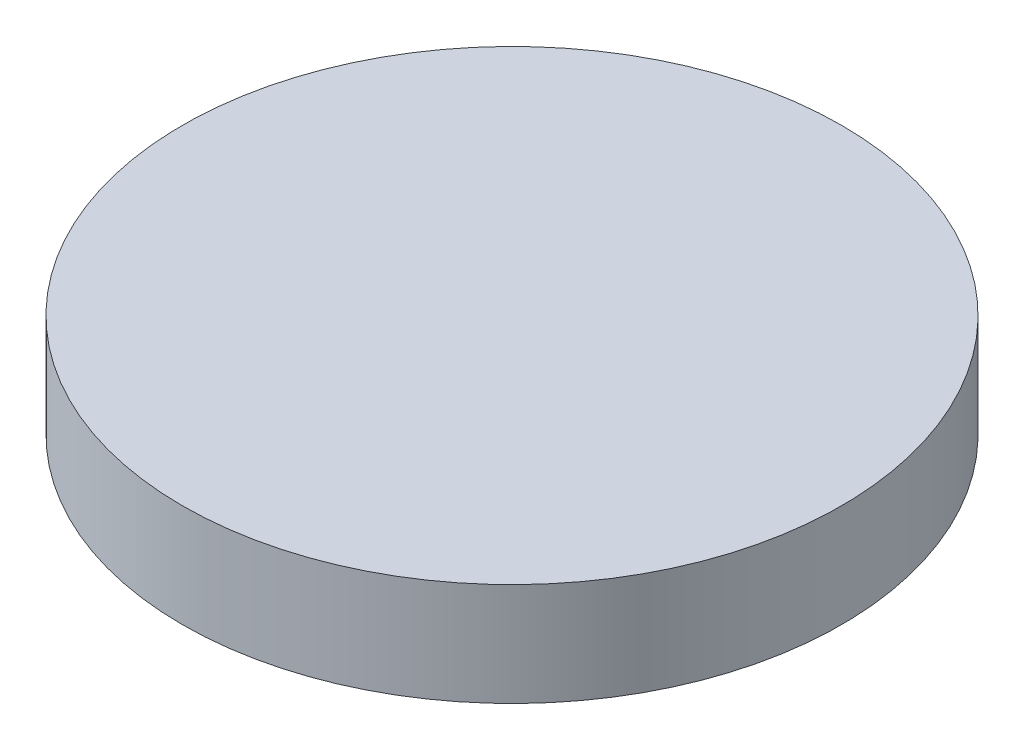
ISO-10303-21;
HEADER;
FILE_DESCRIPTION(('STEP AP214'),'2;1');
FILE_NAME('part.step','',(''),(''),'','','');
FILE_SCHEMA(('AUTOMOTIVE_DESIGN { 1 0 10303 214 1 1 1 1 }'));
ENDSEC;
DATA;
#1=APPLICATION_CONTEXT('core data for automotive mechanical design processes');
#2=APPLICATION_PROTOCOL_DEFINITION('international standard','automotive_design',2000,#1);
#3=PRODUCT_CONTEXT('',#1,'mechanical');
#4=PRODUCT('Part','Part','',(#3));
#5=PRODUCT_RELATED_PRODUCT_CATEGORY('part','',(#4));
#6=PRODUCT_DEFINITION_FORMATION('','',#4);
#7=PRODUCT_DEFINITION_CONTEXT('part definition',#1,'design');
#8=PRODUCT_DEFINITION('design','',#6,#7);
#9=PRODUCT_DEFINITION_SHAPE('','',#8);
#10=(LENGTH_UNIT() NAMED_UNIT(*) SI_UNIT(.MILLI.,.METRE.));
#11=(NAMED_UNIT(*) PLANE_ANGLE_UNIT() SI_UNIT($,.RADIAN.));
#12=(NAMED_UNIT(*) SI_UNIT($,.STERADIAN.) SOLID_ANGLE_UNIT());
#13=UNCERTAINTY_MEASURE_WITH_UNIT(LENGTH_MEASURE(1.E-05),#10,'distance_accuracy_value','');
#14=(GEOMETRIC_REPRESENTATION_CONTEXT(3) GLOBAL_UNCERTAINTY_ASSIGNED_CONTEXT((#13)) GLOBAL_UNIT_ASSIGNED_CONTEXT((#10,
#11,#12)) REPRESENTATION_CONTEXT('',''));
#15=CARTESIAN_POINT('',(0.,0.,0.));
#16=DIRECTION('',(0.,0.,1.));
#17=DIRECTION('',(1.,0.,0.));
#18=AXIS2_PLACEMENT_3D('',#15,#16,#17);
#19=CARTESIAN_POINT('',(0.,3.175,0.));
#20=DIRECTION('',(0.,-1.,0.));
#21=DIRECTION('',(0.,0.,-1.));
#22=AXIS2_PLACEMENT_3D('',#19,#20,#21);
#23=CYLINDRICAL_SURFACE('',#22,10.16);
#24=CARTESIAN_POINT('',(0.,3.175,0.));
#25=DIRECTION('',(0.,1.,0.));
#26=DIRECTION('',(0.,0.,1.));
#27=AXIS2_PLACEMENT_3D('',#24,#25,#26);
#28=CIRCLE('',#27,10.16);
#29=CARTESIAN_POINT('',(0.,3.175,10.16));
#30=VERTEX_POINT('',#29);
#31=EDGE_CURVE('E10',#30,#30,#28,.T.);
#32=ORIENTED_EDGE('',*,*,#31,.F.);
#33=EDGE_LOOP('',(#32));
#34=FACE_BOUND('',#33,.T.);
#35=CARTESIAN_POINT('',(0.,0.,0.));
#36=DIRECTION('',(0.,1.,0.));
#37=DIRECTION('',(0.,0.,1.));
#38=AXIS2_PLACEMENT_3D('',#35,#36,#37);
#39=CIRCLE('',#38,10.16);
#40=CARTESIAN_POINT('',(0.,0.,10.16));
#41=VERTEX_POINT('',#40);
#42=EDGE_CURVE('E40',#41,#41,#39,.T.);
#43=ORIENTED_EDGE('',*,*,#42,.T.);
#44=EDGE_LOOP('',(#43));
#45=FACE_BOUND('',#44,.T.);
#46=ADVANCED_FACE('F37',(#34,#45),#23,.T.);
#47=CARTESIAN_POINT('',(0.,3.175,0.));
#48=DIRECTION('',(0.,1.,0.));
#49=DIRECTION('',(0.,0.,1.));
#50=AXIS2_PLACEMENT_3D('',#47,#48,#49);
#51=PLANE('',#50);
#52=ORIENTED_EDGE('',*,*,#31,.T.);
#53=EDGE_LOOP('',(#52));
#54=FACE_BOUND('',#53,.T.);
#55=ADVANCED_FACE('F93',(#54),#51,.T.);
#56=CARTESIAN_POINT('',(0.,0.,0.));
#57=DIRECTION('',(0.,1.,0.));
#58=DIRECTION('',(0.,0.,1.));
#59=AXIS2_PLACEMENT_3D('',#56,#57,#58);
#60=PLANE('',#59);
#61=CARTESIAN_POINT('',(0.,0.,-4.953));
#62=DIRECTION('',(0.,-1.,0.));
#63=DIRECTION('',(0.,0.,-1.));
#64=AXIS2_PLACEMENT_3D('',#61,#62,#63);
#65=CIRCLE('',#64,4.550000044);
#66=CARTESIAN_POINT('',(0.,0.,-9.503000044));
#67=VERTEX_POINT('',#66);
#68=EDGE_CURVE('E62',#67,#67,#65,.T.);
#69=ORIENTED_EDGE('',*,*,#68,.F.);
#70=EDGE_LOOP('',(#69));
#71=FACE_BOUND('',#70,.T.);
#72=CARTESIAN_POINT('',(0.,0.,4.953));
#73=DIRECTION('',(0.,-1.,0.));
#74=DIRECTION('',(0.,0.,-1.));
#75=AXIS2_PLACEMENT_3D('',#72,#73,#74);
#76=CIRCLE('',#75,4.550000044);
#77=CARTESIAN_POINT('',(0.,0.,0.402999955999999));
#78=VERTEX_POINT('',#77);
#79=EDGE_CURVE('E53',#78,#78,#76,.T.);
#80=ORIENTED_EDGE('',*,*,#79,.F.);
#81=EDGE_LOOP('',(#80));
#82=FACE_BOUND('',#81,.T.);
#83=ORIENTED_EDGE('',*,*,#42,.F.);
#84=EDGE_LOOP('',(#83));
#85=FACE_BOUND('',#84,.T.);
#86=ADVANCED_FACE('F89',(#71,#82,#85),#60,.F.);
#87=CARTESIAN_POINT('',(0.,1.524,4.953));
#88=DIRECTION('',(0.,-1.,0.));
#89=DIRECTION('',(0.,0.,-1.));
#90=AXIS2_PLACEMENT_3D('',#87,#88,#89);
#91=CYLINDRICAL_SURFACE('',#90,4.550000044);
#92=CARTESIAN_POINT('',(0.,1.524,4.953));
#93=DIRECTION('',(0.,-1.,0.));
#94=DIRECTION('',(0.,0.,-1.));
#95=AXIS2_PLACEMENT_3D('',#92,#93,#94);
#96=CIRCLE('',#95,4.550000044);
#97=CARTESIAN_POINT('',(0.,1.524,0.402999955999999));
#98=VERTEX_POINT('',#97);
#99=EDGE_CURVE('E57',#98,#98,#96,.T.);
#100=CARTESIAN_POINT('',(0.,1.524,0.402999955999999));
#101=CARTESIAN_POINT('',(0.,1.508125,0.402999955999999));
#102=CARTESIAN_POINT('',(0.,1.49225,0.402999955999999));
#103=CARTESIAN_POINT('',(0.,1.4605,0.402999955999999));
#104=CARTESIAN_POINT('',(0.,1.444625,0.402999955999999));
#105=CARTESIAN_POINT('',(0.,1.412875,0.402999955999999));
#106=CARTESIAN_POINT('',(0.,1.397,0.402999955999999));
#107=CARTESIAN_POINT('',(0.,1.36525,0.402999955999999));
#108=CARTESIAN_POINT('',(0.,1.349375,0.402999955999999));
#109=CARTESIAN_POINT('',(0.,1.317625,0.402999955999999));
#110=CARTESIAN_POINT('',(0.,1.30175,0.402999955999999));
#111=CARTESIAN_POINT('',(0.,1.27,0.402999955999999));
#112=CARTESIAN_POINT('',(0.,1.254125,0.402999955999999));
#113=CARTESIAN_POINT('',(0.,1.222375,0.402999955999999));
#114=CARTESIAN_POINT('',(0.,1.2065,0.402999955999999));
#115=CARTESIAN_POINT('',(0.,1.17475,0.402999955999999));
#116=CARTESIAN_POINT('',(0.,1.158875,0.402999955999999));
#117=CARTESIAN_POINT('',(0.,1.127125,0.402999955999999));
#118=CARTESIAN_POINT('',(0.,1.11125,0.402999955999999));
#119=CARTESIAN_POINT('',(0.,1.0795,0.402999955999999));
#120=CARTESIAN_POINT('',(0.,1.063625,0.402999955999999));
#121=CARTESIAN_POINT('',(0.,1.031875,0.402999955999999));
#122=CARTESIAN_POINT('',(0.,1.016,0.402999955999999));
#123=CARTESIAN_POINT('',(0.,0.98425,0.402999955999999));
#124=CARTESIAN_POINT('',(0.,0.968375,0.402999955999999));
#125=CARTESIAN_POINT('',(0.,0.936625,0.402999955999999));
#126=CARTESIAN_POINT('',(0.,0.92075,0.402999955999999));
#127=CARTESIAN_POINT('',(0.,0.889,0.402999955999999));
#128=CARTESIAN_POINT('',(0.,0.873125,0.402999955999999));
#129=CARTESIAN_POINT('',(0.,0.841375,0.402999955999999));
#130=CARTESIAN_POINT('',(0.,0.8255,0.402999955999999));
#131=CARTESIAN_POINT('',(0.,0.79375,0.402999955999999));
#132=CARTESIAN_POINT('',(0.,0.777875,0.402999955999999));
#133=CARTESIAN_POINT('',(0.,0.746125,0.402999955999999));
#134=CARTESIAN_POINT('',(0.,0.73025,0.402999955999999));
#135=CARTESIAN_POINT('',(0.,0.6985,0.402999955999999));
#136=CARTESIAN_POINT('',(0.,0.682625,0.402999955999999));
#137=CARTESIAN_POINT('',(0.,0.650875,0.402999955999999));
#138=CARTESIAN_POINT('',(0.,0.635,0.402999955999999));
#139=CARTESIAN_POINT('',(0.,0.60325,0.402999955999999));
#140=CARTESIAN_POINT('',(0.,0.587375,0.402999955999999));
#141=CARTESIAN_POINT('',(0.,0.555625,0.402999955999999));
#142=CARTESIAN_POINT('',(0.,0.53975,0.402999955999999));
#143=CARTESIAN_POINT('',(0.,0.508,0.402999955999999));
#144=CARTESIAN_POINT('',(0.,0.492125,0.402999955999999));
#145=CARTESIAN_POINT('',(0.,0.460375,0.402999955999999));
#146=CARTESIAN_POINT('',(0.,0.4445,0.402999955999999));
#147=CARTESIAN_POINT('',(0.,0.41275,0.402999955999999));
#148=CARTESIAN_POINT('',(0.,0.396875,0.402999955999999));
#149=CARTESIAN_POINT('',(0.,0.365125,0.402999955999999));
#150=CARTESIAN_POINT('',(0.,0.34925,0.402999955999999));
#151=CARTESIAN_POINT('',(0.,0.3175,0.402999955999999));
#152=CARTESIAN_POINT('',(0.,0.301625,0.402999955999999));
#153=CARTESIAN_POINT('',(0.,0.269875,0.402999955999999));
#154=CARTESIAN_POINT('',(0.,0.254,0.402999955999999));
#155=CARTESIAN_POINT('',(0.,0.22225,0.402999955999999));
#156=CARTESIAN_POINT('',(0.,0.206375,0.402999955999999));
#157=CARTESIAN_POINT('',(0.,0.174625,0.402999955999999));
#158=CARTESIAN_POINT('',(0.,0.15875,0.402999955999999));
#159=CARTESIAN_POINT('',(0.,0.127,0.402999955999999));
#160=CARTESIAN_POINT('',(0.,0.111125,0.402999955999999));
#161=CARTESIAN_POINT('',(0.,0.079375,0.402999955999999));
#162=CARTESIAN_POINT('',(0.,0.0635,0.402999955999999));
#163=CARTESIAN_POINT('',(0.,0.0317499999999999,0.402999955999999));
#164=CARTESIAN_POINT('',(0.,0.015875,0.402999955999999));
#165=CARTESIAN_POINT('',(0.,0.,0.402999955999999));
#166=B_SPLINE_CURVE_WITH_KNOTS('',3,(#100,#101,#102,#103,#104,#105,#106,#107,#108,#109,#110,
#111,#112,#113,#114,#115,#116,#117,#118,#119,#120,#121,#122,#123,#124,#125,#126,#127,#128,#129,
#130,#131,#132,#133,#134,#135,#136,#137,#138,#139,#140,#141,#142,#143,#144,#145,#146,#147,#148,
#149,#150,#151,#152,#153,#154,#155,#156,#157,#158,#159,#160,#161,#162,#163,#164,#165),
.UNSPECIFIED.,.F.,.F.,(4,2,2,2,2,2,2,2,2,2,2,2,2,2,2,2,2,2,2,2,2,2,2,2,2,2,2,2,2,2,2,2,4),(0.,
0.0476250000000001,0.0952500000000001,0.142875,0.1905,0.238125,0.28575,0.333375,0.381,0.428625,
0.47625,0.523875,0.5715,0.619125,0.66675,0.714375,0.762,0.809625,0.85725,0.904875,0.9525,
1.000125,1.04775,1.095375,1.143,1.190625,1.23825,1.285875,1.3335,1.381125,1.42875,1.476375,
1.524),.UNSPECIFIED.);
#167=EDGE_CURVE('BSEAM92',#98,#78,#166,.T.);
#168=ORIENTED_EDGE('',*,*,#99,.F.);
#169=ORIENTED_EDGE('',*,*,#79,.T.);
#170=ORIENTED_EDGE('',*,*,#167,.T.);
#171=ORIENTED_EDGE('',*,*,#167,.F.);
#172=EDGE_LOOP('',(#168,#170,#169,#171));
#173=FACE_BOUND('',#172,.T.);
#174=ADVANCED_FACE('F92',(#173),#91,.F.);
#175=CARTESIAN_POINT('',(0.,1.524,4.953));
#176=DIRECTION('',(0.,-1.,0.));
#177=DIRECTION('',(0.,0.,-1.));
#178=AXIS2_PLACEMENT_3D('',#175,#176,#177);
#179=PLANE('',#178);
#180=CARTESIAN_POINT('',(0.,1.524,4.953));
#181=DIRECTION('',(0.,-1.,0.));
#182=DIRECTION('',(0.,0.,-1.));
#183=AXIS2_PLACEMENT_3D('',#180,#181,#182);
#184=CIRCLE('',#183,3.550000044);
#185=CARTESIAN_POINT('',(0.,1.524,1.402999956));
#186=VERTEX_POINT('',#185);
#187=EDGE_CURVE('E49',#186,#186,#184,.T.);
#188=ORIENTED_EDGE('',*,*,#187,.F.);
#189=EDGE_LOOP('',(#188));
#190=FACE_BOUND('',#189,.T.);
#191=ORIENTED_EDGE('',*,*,#99,.T.);
#192=EDGE_LOOP('',(#191));
#193=FACE_BOUND('',#192,.T.);
#194=ADVANCED_FACE('F111',(#190,#193),#179,.T.);
#195=CARTESIAN_POINT('',(0.,1.524,4.953));
#196=DIRECTION('',(0.,-1.,0.));
#197=DIRECTION('',(0.,0.,-1.));
#198=AXIS2_PLACEMENT_3D('',#195,#196,#197);
#199=CYLINDRICAL_SURFACE('',#198,3.550000044);
#200=CARTESIAN_POINT('',(0.,0.,4.953));
#201=DIRECTION('',(0.,-1.,0.));
#202=DIRECTION('',(0.,0.,-1.));
#203=AXIS2_PLACEMENT_3D('',#200,#201,#202);
#204=CIRCLE('',#203,3.550000044);
#205=CARTESIAN_POINT('',(0.,0.,1.402999956));
#206=VERTEX_POINT('',#205);
#207=EDGE_CURVE('E52',#206,#206,#204,.T.);
#208=CARTESIAN_POINT('',(0.,1.524,1.402999956));
#209=CARTESIAN_POINT('',(0.,1.508125,1.402999956));
#210=CARTESIAN_POINT('',(0.,1.49225,1.402999956));
#211=CARTESIAN_POINT('',(0.,1.4605,1.402999956));
#212=CARTESIAN_POINT('',(0.,1.444625,1.402999956));
#213=CARTESIAN_POINT('',(0.,1.412875,1.402999956));
#214=CARTESIAN_POINT('',(0.,1.397,1.402999956));
#215=CARTESIAN_POINT('',(0.,1.36525,1.402999956));
#216=CARTESIAN_POINT('',(0.,1.349375,1.402999956));
#217=CARTESIAN_POINT('',(0.,1.317625,1.402999956));
#218=CARTESIAN_POINT('',(0.,1.30175,1.402999956));
#219=CARTESIAN_POINT('',(0.,1.27,1.402999956));
#220=CARTESIAN_POINT('',(0.,1.254125,1.402999956));
#221=CARTESIAN_POINT('',(0.,1.222375,1.402999956));
#222=CARTESIAN_POINT('',(0.,1.2065,1.402999956));
#223=CARTESIAN_POINT('',(0.,1.17475,1.402999956));
#224=CARTESIAN_POINT('',(0.,1.158875,1.402999956));
#225=CARTESIAN_POINT('',(0.,1.127125,1.402999956));
#226=CARTESIAN_POINT('',(0.,1.11125,1.402999956));
#227=CARTESIAN_POINT('',(0.,1.0795,1.402999956));
#228=CARTESIAN_POINT('',(0.,1.063625,1.402999956));
#229=CARTESIAN_POINT('',(0.,1.031875,1.402999956));
#230=CARTESIAN_POINT('',(0.,1.016,1.402999956));
#231=CARTESIAN_POINT('',(0.,0.98425,1.402999956));
#232=CARTESIAN_POINT('',(0.,0.968375,1.402999956));
#233=CARTESIAN_POINT('',(0.,0.936625,1.402999956));
#234=CARTESIAN_POINT('',(0.,0.92075,1.402999956));
#235=CARTESIAN_POINT('',(0.,0.889,1.402999956));
#236=CARTESIAN_POINT('',(0.,0.873125,1.402999956));
#237=CARTESIAN_POINT('',(0.,0.841375,1.402999956));
#238=CARTESIAN_POINT('',(0.,0.8255,1.402999956));
#239=CARTESIAN_POINT('',(0.,0.79375,1.402999956));
#240=CARTESIAN_POINT('',(0.,0.777875,1.402999956));
#241=CARTESIAN_POINT('',(0.,0.746125,1.402999956));
#242=CARTESIAN_POINT('',(0.,0.73025,1.402999956));
#243=CARTESIAN_POINT('',(0.,0.6985,1.402999956));
#244=CARTESIAN_POINT('',(0.,0.682625,1.402999956));
#245=CARTESIAN_POINT('',(0.,0.650875,1.402999956));
#246=CARTESIAN_POINT('',(0.,0.635,1.402999956));
#247=CARTESIAN_POINT('',(0.,0.60325,1.402999956));
#248=CARTESIAN_POINT('',(0.,0.587375,1.402999956));
#249=CARTESIAN_POINT('',(0.,0.555625,1.402999956));
#250=CARTESIAN_POINT('',(0.,0.53975,1.402999956));
#251=CARTESIAN_POINT('',(0.,0.508,1.402999956));
#252=CARTESIAN_POINT('',(0.,0.492125,1.402999956));
#253=CARTESIAN_POINT('',(0.,0.460375,1.402999956));
#254=CARTESIAN_POINT('',(0.,0.4445,1.402999956));
#255=CARTESIAN_POINT('',(0.,0.41275,1.402999956));
#256=CARTESIAN_POINT('',(0.,0.396875,1.402999956));
#257=CARTESIAN_POINT('',(0.,0.365125,1.402999956));
#258=CARTESIAN_POINT('',(0.,0.34925,1.402999956));
#259=CARTESIAN_POINT('',(0.,0.3175,1.402999956));
#260=CARTESIAN_POINT('',(0.,0.301625,1.402999956));
#261=CARTESIAN_POINT('',(0.,0.269875,1.402999956));
#262=CARTESIAN_POINT('',(0.,0.254,1.402999956));
#263=CARTESIAN_POINT('',(0.,0.22225,1.402999956));
#264=CARTESIAN_POINT('',(0.,0.206375,1.402999956));
#265=CARTESIAN_POINT('',(0.,0.174625,1.402999956));
#266=CARTESIAN_POINT('',(0.,0.15875,1.402999956));
#267=CARTESIAN_POINT('',(0.,0.127,1.402999956));
#268=CARTESIAN_POINT('',(0.,0.111125,1.402999956));
#269=CARTESIAN_POINT('',(0.,0.079375,1.402999956));
#270=CARTESIAN_POINT('',(0.,0.0635,1.402999956));
#271=CARTESIAN_POINT('',(0.,0.0317499999999999,1.402999956));
#272=CARTESIAN_POINT('',(0.,0.015875,1.402999956));
#273=CARTESIAN_POINT('',(0.,0.,1.402999956));
#274=B_SPLINE_CURVE_WITH_KNOTS('',3,(#208,#209,#210,#211,#212,#213,#214,#215,#216,#217,#218,
#219,#220,#221,#222,#223,#224,#225,#226,#227,#228,#229,#230,#231,#232,#233,#234,#235,#236,#237,
#238,#239,#240,#241,#242,#243,#244,#245,#246,#247,#248,#249,#250,#251,#252,#253,#254,#255,#256,
#257,#258,#259,#260,#261,#262,#263,#264,#265,#266,#267,#268,#269,#270,#271,#272,#273),
.UNSPECIFIED.,.F.,.F.,(4,2,2,2,2,2,2,2,2,2,2,2,2,2,2,2,2,2,2,2,2,2,2,2,2,2,2,2,2,2,2,2,4),(0.,
0.0476250000000001,0.0952500000000001,0.142875,0.1905,0.238125,0.28575,0.333375,0.381,0.428625,
0.47625,0.523875,0.5715,0.619125,0.66675,0.714375,0.762,0.809625,0.85725,0.904875,0.9525,
1.000125,1.04775,1.095375,1.143,1.190625,1.23825,1.285875,1.3335,1.381125,1.42875,1.476375,
1.524),.UNSPECIFIED.);
#275=EDGE_CURVE('BSEAM85',#186,#206,#274,.T.);
#276=ORIENTED_EDGE('',*,*,#187,.T.);
#277=ORIENTED_EDGE('',*,*,#207,.F.);
#278=ORIENTED_EDGE('',*,*,#275,.T.);
#279=ORIENTED_EDGE('',*,*,#275,.F.);
#280=EDGE_LOOP('',(#276,#278,#277,#279));
#281=FACE_BOUND('',#280,.T.);
#282=ADVANCED_FACE('F85',(#281),#199,.T.);
#283=CARTESIAN_POINT('',(0.,1.524,-4.953));
#284=DIRECTION('',(0.,-1.,0.));
#285=DIRECTION('',(0.,0.,-1.));
#286=AXIS2_PLACEMENT_3D('',#283,#284,#285);
#287=CYLINDRICAL_SURFACE('',#286,4.550000044);
#288=CARTESIAN_POINT('',(0.,1.524,-4.953));
#289=DIRECTION('',(0.,-1.,0.));
#290=DIRECTION('',(0.,0.,-1.));
#291=AXIS2_PLACEMENT_3D('',#288,#289,#290);
#292=CIRCLE('',#291,4.550000044);
#293=CARTESIAN_POINT('',(0.,1.524,-9.503000044));
#294=VERTEX_POINT('',#293);
#295=EDGE_CURVE('E47',#294,#294,#292,.T.);
#296=CARTESIAN_POINT('',(0.,1.524,-9.503000044));
#297=CARTESIAN_POINT('',(0.,1.508125,-9.503000044));
#298=CARTESIAN_POINT('',(0.,1.49225,-9.503000044));
#299=CARTESIAN_POINT('',(0.,1.4605,-9.503000044));
#300=CARTESIAN_POINT('',(0.,1.444625,-9.503000044));
#301=CARTESIAN_POINT('',(0.,1.412875,-9.503000044));
#302=CARTESIAN_POINT('',(0.,1.397,-9.503000044));
#303=CARTESIAN_POINT('',(0.,1.36525,-9.503000044));
#304=CARTESIAN_POINT('',(0.,1.349375,-9.503000044));
#305=CARTESIAN_POINT('',(0.,1.317625,-9.503000044));
#306=CARTESIAN_POINT('',(0.,1.30175,-9.503000044));
#307=CARTESIAN_POINT('',(0.,1.27,-9.503000044));
#308=CARTESIAN_POINT('',(0.,1.254125,-9.503000044));
#309=CARTESIAN_POINT('',(0.,1.222375,-9.503000044));
#310=CARTESIAN_POINT('',(0.,1.2065,-9.503000044));
#311=CARTESIAN_POINT('',(0.,1.17475,-9.503000044));
#312=CARTESIAN_POINT('',(0.,1.158875,-9.503000044));
#313=CARTESIAN_POINT('',(0.,1.127125,-9.503000044));
#314=CARTESIAN_POINT('',(0.,1.11125,-9.503000044));
#315=CARTESIAN_POINT('',(0.,1.0795,-9.503000044));
#316=CARTESIAN_POINT('',(0.,1.063625,-9.503000044));
#317=CARTESIAN_POINT('',(0.,1.031875,-9.503000044));
#318=CARTESIAN_POINT('',(0.,1.016,-9.503000044));
#319=CARTESIAN_POINT('',(0.,0.98425,-9.503000044));
#320=CARTESIAN_POINT('',(0.,0.968375,-9.503000044));
#321=CARTESIAN_POINT('',(0.,0.936625,-9.503000044));
#322=CARTESIAN_POINT('',(0.,0.92075,-9.503000044));
#323=CARTESIAN_POINT('',(0.,0.889,-9.503000044));
#324=CARTESIAN_POINT('',(0.,0.873125,-9.503000044));
#325=CARTESIAN_POINT('',(0.,0.841375,-9.503000044));
#326=CARTESIAN_POINT('',(0.,0.8255,-9.503000044));
#327=CARTESIAN_POINT('',(0.,0.79375,-9.503000044));
#328=CARTESIAN_POINT('',(0.,0.777875,-9.503000044));
#329=CARTESIAN_POINT('',(0.,0.746125,-9.503000044));
#330=CARTESIAN_POINT('',(0.,0.73025,-9.503000044));
#331=CARTESIAN_POINT('',(0.,0.6985,-9.503000044));
#332=CARTESIAN_POINT('',(0.,0.682625,-9.503000044));
#333=CARTESIAN_POINT('',(0.,0.650875,-9.503000044));
#334=CARTESIAN_POINT('',(0.,0.635,-9.503000044));
#335=CARTESIAN_POINT('',(0.,0.60325,-9.503000044));
#336=CARTESIAN_POINT('',(0.,0.587375,-9.503000044));
#337=CARTESIAN_POINT('',(0.,0.555625,-9.503000044));
#338=CARTESIAN_POINT('',(0.,0.53975,-9.503000044));
#339=CARTESIAN_POINT('',(0.,0.508,-9.503000044));
#340=CARTESIAN_POINT('',(0.,0.492125,-9.503000044));
#341=CARTESIAN_POINT('',(0.,0.460375,-9.503000044));
#342=CARTESIAN_POINT('',(0.,0.4445,-9.503000044));
#343=CARTESIAN_POINT('',(0.,0.41275,-9.503000044));
#344=CARTESIAN_POINT('',(0.,0.396875,-9.503000044));
#345=CARTESIAN_POINT('',(0.,0.365125,-9.503000044));
#346=CARTESIAN_POINT('',(0.,0.34925,-9.503000044));
#347=CARTESIAN_POINT('',(0.,0.3175,-9.503000044));
#348=CARTESIAN_POINT('',(0.,0.301625,-9.503000044));
#349=CARTESIAN_POINT('',(0.,0.269875,-9.503000044));
#350=CARTESIAN_POINT('',(0.,0.254,-9.503000044));
#351=CARTESIAN_POINT('',(0.,0.22225,-9.503000044));
#352=CARTESIAN_POINT('',(0.,0.206375,-9.503000044));
#353=CARTESIAN_POINT('',(0.,0.174625,-9.503000044));
#354=CARTESIAN_POINT('',(0.,0.15875,-9.503000044));
#355=CARTESIAN_POINT('',(0.,0.127,-9.503000044));
#356=CARTESIAN_POINT('',(0.,0.111125,-9.503000044));
#357=CARTESIAN_POINT('',(0.,0.079375,-9.503000044));
#358=CARTESIAN_POINT('',(0.,0.0635,-9.503000044));
#359=CARTESIAN_POINT('',(0.,0.0317499999999999,-9.503000044));
#360=CARTESIAN_POINT('',(0.,0.015875,-9.503000044));
#361=CARTESIAN_POINT('',(0.,0.,-9.503000044));
#362=B_SPLINE_CURVE_WITH_KNOTS('',3,(#296,#297,#298,#299,#300,#301,#302,#303,#304,#305,#306,
#307,#308,#309,#310,#311,#312,#313,#314,#315,#316,#317,#318,#319,#320,#321,#322,#323,#324,#325,
#326,#327,#328,#329,#330,#331,#332,#333,#334,#335,#336,#337,#338,#339,#340,#341,#342,#343,#344,
#345,#346,#347,#348,#349,#350,#351,#352,#353,#354,#355,#356,#357,#358,#359,#360,#361),
.UNSPECIFIED.,.F.,.F.,(4,2,2,2,2,2,2,2,2,2,2,2,2,2,2,2,2,2,2,2,2,2,2,2,2,2,2,2,2,2,2,2,4),(0.,
0.0476250000000001,0.0952500000000001,0.142875,0.1905,0.238125,0.28575,0.333375,0.381,0.428625,
0.47625,0.523875,0.5715,0.619125,0.66675,0.714375,0.762,0.809625,0.85725,0.904875,0.9525,
1.000125,1.04775,1.095375,1.143,1.190625,1.23825,1.285875,1.3335,1.381125,1.42875,1.476375,
1.524),.UNSPECIFIED.);
#363=EDGE_CURVE('BSEAM79',#294,#67,#362,.T.);
#364=ORIENTED_EDGE('',*,*,#295,.F.);
#365=ORIENTED_EDGE('',*,*,#68,.T.);
#366=ORIENTED_EDGE('',*,*,#363,.T.);
#367=ORIENTED_EDGE('',*,*,#363,.F.);
#368=EDGE_LOOP('',(#364,#366,#365,#367));
#369=FACE_BOUND('',#368,.T.);
#370=ADVANCED_FACE('F79',(#369),#287,.F.);
#371=CARTESIAN_POINT('',(0.,1.524,-4.953));
#372=DIRECTION('',(0.,-1.,0.));
#373=DIRECTION('',(0.,0.,-1.));
#374=AXIS2_PLACEMENT_3D('',#371,#372,#373);
#375=PLANE('',#374);
#376=CARTESIAN_POINT('',(0.,1.524,-4.953));
#377=DIRECTION('',(0.,-1.,0.));
#378=DIRECTION('',(0.,0.,-1.));
#379=AXIS2_PLACEMENT_3D('',#376,#377,#378);
#380=CIRCLE('',#379,3.550000044);
#381=CARTESIAN_POINT('',(0.,1.524,-8.503000044));
#382=VERTEX_POINT('',#381);
#383=EDGE_CURVE('E65',#382,#382,#380,.T.);
#384=ORIENTED_EDGE('',*,*,#383,.F.);
#385=EDGE_LOOP('',(#384));
#386=FACE_BOUND('',#385,.T.);
#387=ORIENTED_EDGE('',*,*,#295,.T.);
#388=EDGE_LOOP('',(#387));
#389=FACE_BOUND('',#388,.T.);
#390=ADVANCED_FACE('F76',(#386,#389),#375,.T.);
#391=CARTESIAN_POINT('',(0.,1.524,-4.953));
#392=DIRECTION('',(0.,-1.,0.));
#393=DIRECTION('',(0.,0.,-1.));
#394=AXIS2_PLACEMENT_3D('',#391,#392,#393);
#395=CYLINDRICAL_SURFACE('',#394,3.550000044);
#396=CARTESIAN_POINT('',(0.,0.,-4.953));
#397=DIRECTION('',(0.,-1.,0.));
#398=DIRECTION('',(0.,0.,-1.));
#399=AXIS2_PLACEMENT_3D('',#396,#397,#398);
#400=CIRCLE('',#399,3.550000044);
#401=CARTESIAN_POINT('',(0.,0.,-8.503000044));
#402=VERTEX_POINT('',#401);
#403=EDGE_CURVE('E56',#402,#402,#400,.T.);
#404=CARTESIAN_POINT('',(0.,1.524,-8.503000044));
#405=CARTESIAN_POINT('',(0.,1.508125,-8.503000044));
#406=CARTESIAN_POINT('',(0.,1.49225,-8.503000044));
#407=CARTESIAN_POINT('',(0.,1.4605,-8.503000044));
#408=CARTESIAN_POINT('',(0.,1.444625,-8.503000044));
#409=CARTESIAN_POINT('',(0.,1.412875,-8.503000044));
#410=CARTESIAN_POINT('',(0.,1.397,-8.503000044));
#411=CARTESIAN_POINT('',(0.,1.36525,-8.503000044));
#412=CARTESIAN_POINT('',(0.,1.349375,-8.503000044));
#413=CARTESIAN_POINT('',(0.,1.317625,-8.503000044));
#414=CARTESIAN_POINT('',(0.,1.30175,-8.503000044));
#415=CARTESIAN_POINT('',(0.,1.27,-8.503000044));
#416=CARTESIAN_POINT('',(0.,1.254125,-8.503000044));
#417=CARTESIAN_POINT('',(0.,1.222375,-8.503000044));
#418=CARTESIAN_POINT('',(0.,1.2065,-8.503000044));
#419=CARTESIAN_POINT('',(0.,1.17475,-8.503000044));
#420=CARTESIAN_POINT('',(0.,1.158875,-8.503000044));
#421=CARTESIAN_POINT('',(0.,1.127125,-8.503000044));
#422=CARTESIAN_POINT('',(0.,1.11125,-8.503000044));
#423=CARTESIAN_POINT('',(0.,1.0795,-8.503000044));
#424=CARTESIAN_POINT('',(0.,1.063625,-8.503000044));
#425=CARTESIAN_POINT('',(0.,1.031875,-8.503000044));
#426=CARTESIAN_POINT('',(0.,1.016,-8.503000044));
#427=CARTESIAN_POINT('',(0.,0.98425,-8.503000044));
#428=CARTESIAN_POINT('',(0.,0.968375,-8.503000044));
#429=CARTESIAN_POINT('',(0.,0.936625,-8.503000044));
#430=CARTESIAN_POINT('',(0.,0.92075,-8.503000044));
#431=CARTESIAN_POINT('',(0.,0.889,-8.503000044));
#432=CARTESIAN_POINT('',(0.,0.873125,-8.503000044));
#433=CARTESIAN_POINT('',(0.,0.841375,-8.503000044));
#434=CARTESIAN_POINT('',(0.,0.8255,-8.503000044));
#435=CARTESIAN_POINT('',(0.,0.79375,-8.503000044));
#436=CARTESIAN_POINT('',(0.,0.777875,-8.503000044));
#437=CARTESIAN_POINT('',(0.,0.746125,-8.503000044));
#438=CARTESIAN_POINT('',(0.,0.73025,-8.503000044));
#439=CARTESIAN_POINT('',(0.,0.6985,-8.503000044));
#440=CARTESIAN_POINT('',(0.,0.682625,-8.503000044));
#441=CARTESIAN_POINT('',(0.,0.650875,-8.503000044));
#442=CARTESIAN_POINT('',(0.,0.635,-8.503000044));
#443=CARTESIAN_POINT('',(0.,0.60325,-8.503000044));
#444=CARTESIAN_POINT('',(0.,0.587375,-8.503000044));
#445=CARTESIAN_POINT('',(0.,0.555625,-8.503000044));
#446=CARTESIAN_POINT('',(0.,0.53975,-8.503000044));
#447=CARTESIAN_POINT('',(0.,0.508,-8.503000044));
#448=CARTESIAN_POINT('',(0.,0.492125,-8.503000044));
#449=CARTESIAN_POINT('',(0.,0.460375,-8.503000044));
#450=CARTESIAN_POINT('',(0.,0.4445,-8.503000044));
#451=CARTESIAN_POINT('',(0.,0.41275,-8.503000044));
#452=CARTESIAN_POINT('',(0.,0.396875,-8.503000044));
#453=CARTESIAN_POINT('',(0.,0.365125,-8.503000044));
#454=CARTESIAN_POINT('',(0.,0.34925,-8.503000044));
#455=CARTESIAN_POINT('',(0.,0.3175,-8.503000044));
#456=CARTESIAN_POINT('',(0.,0.301625,-8.503000044));
#457=CARTESIAN_POINT('',(0.,0.269875,-8.503000044));
#458=CARTESIAN_POINT('',(0.,0.254,-8.503000044));
#459=CARTESIAN_POINT('',(0.,0.22225,-8.503000044));
#460=CARTESIAN_POINT('',(0.,0.206375,-8.503000044));
#461=CARTESIAN_POINT('',(0.,0.174625,-8.503000044));
#462=CARTESIAN_POINT('',(0.,0.15875,-8.503000044));
#463=CARTESIAN_POINT('',(0.,0.127,-8.503000044));
#464=CARTESIAN_POINT('',(0.,0.111125,-8.503000044));
#465=CARTESIAN_POINT('',(0.,0.079375,-8.503000044));
#466=CARTESIAN_POINT('',(0.,0.0635,-8.503000044));
#467=CARTESIAN_POINT('',(0.,0.0317499999999999,-8.503000044));
#468=CARTESIAN_POINT('',(0.,0.015875,-8.503000044));
#469=CARTESIAN_POINT('',(0.,0.,-8.503000044));
#470=B_SPLINE_CURVE_WITH_KNOTS('',3,(#404,#405,#406,#407,#408,#409,#410,#411,#412,#413,#414,
#415,#416,#417,#418,#419,#420,#421,#422,#423,#424,#425,#426,#427,#428,#429,#430,#431,#432,#433,
#434,#435,#436,#437,#438,#439,#440,#441,#442,#443,#444,#445,#446,#447,#448,#449,#450,#451,#452,
#453,#454,#455,#456,#457,#458,#459,#460,#461,#462,#463,#464,#465,#466,#467,#468,#469),
.UNSPECIFIED.,.F.,.F.,(4,2,2,2,2,2,2,2,2,2,2,2,2,2,2,2,2,2,2,2,2,2,2,2,2,2,2,2,2,2,2,2,4),(0.,
0.0476250000000001,0.0952500000000001,0.142875,0.1905,0.238125,0.28575,0.333375,0.381,0.428625,
0.47625,0.523875,0.5715,0.619125,0.66675,0.714375,0.762,0.809625,0.85725,0.904875,0.9525,
1.000125,1.04775,1.095375,1.143,1.190625,1.23825,1.285875,1.3335,1.381125,1.42875,1.476375,
1.524),.UNSPECIFIED.);
#471=EDGE_CURVE('BSEAM73',#382,#402,#470,.T.);
#472=ORIENTED_EDGE('',*,*,#383,.T.);
#473=ORIENTED_EDGE('',*,*,#403,.F.);
#474=ORIENTED_EDGE('',*,*,#471,.T.);
#475=ORIENTED_EDGE('',*,*,#471,.F.);
#476=EDGE_LOOP('',(#472,#474,#473,#475));
#477=FACE_BOUND('',#476,.T.);
#478=ADVANCED_FACE('F73',(#477),#395,.T.);
#479=ORIENTED_EDGE('',*,*,#207,.T.);
#480=EDGE_LOOP('',(#479));
#481=FACE_BOUND('',#480,.T.);
#482=ADVANCED_FACE('F95',(#481),#60,.F.);
#483=ORIENTED_EDGE('',*,*,#403,.T.);
#484=EDGE_LOOP('',(#483));
#485=FACE_BOUND('',#484,.T.);
#486=ADVANCED_FACE('F94',(#485),#60,.F.);
#487=CLOSED_SHELL('',(#46,#55,#86,#174,#194,#282,#370,#390,#478,#482,#486));
#488=MANIFOLD_SOLID_BREP('B2',#487);
#489=ADVANCED_BREP_SHAPE_REPRESENTATION('',(#18,#488),#14);
#490=SHAPE_DEFINITION_REPRESENTATION(#9,#489);
ENDSEC;
END-ISO-10303-21;
